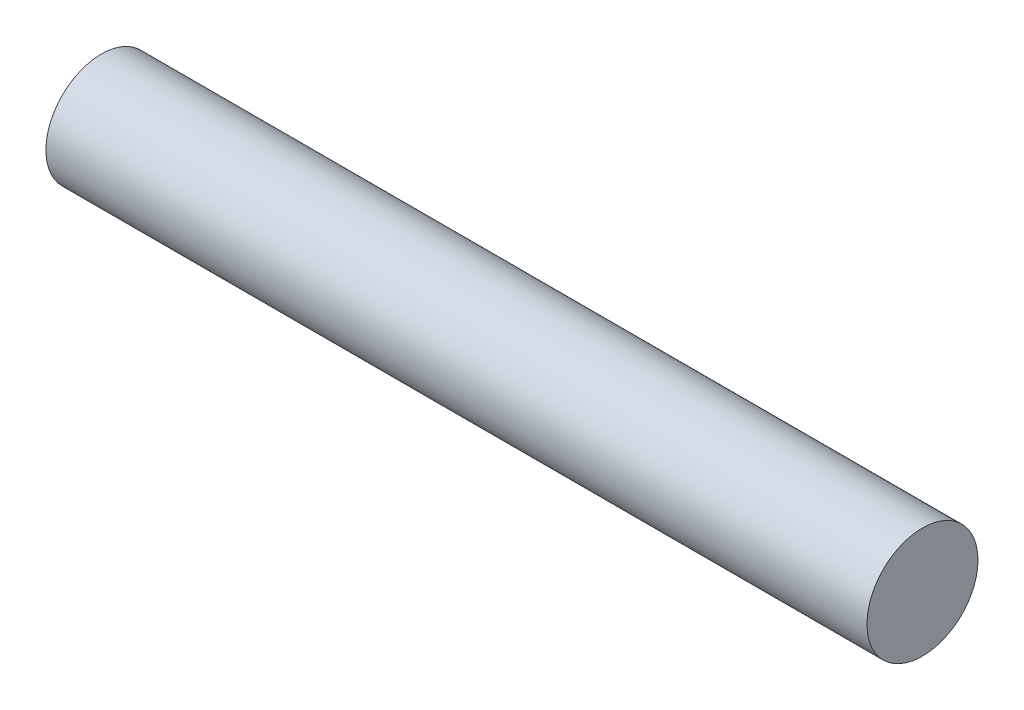
ISO-10303-21;
HEADER;
FILE_DESCRIPTION(('STEP AP214'),'2;1');
FILE_NAME('part.step','',(''),(''),'','','');
FILE_SCHEMA(('AUTOMOTIVE_DESIGN { 1 0 10303 214 1 1 1 1 }'));
ENDSEC;
DATA;
#1=APPLICATION_CONTEXT('core data for automotive mechanical design processes');
#2=APPLICATION_PROTOCOL_DEFINITION('international standard','automotive_design',2000,#1);
#3=PRODUCT_CONTEXT('',#1,'mechanical');
#4=PRODUCT('Part','Part','',(#3));
#5=PRODUCT_RELATED_PRODUCT_CATEGORY('part','',(#4));
#6=PRODUCT_DEFINITION_FORMATION('','',#4);
#7=PRODUCT_DEFINITION_CONTEXT('part definition',#1,'design');
#8=PRODUCT_DEFINITION('design','',#6,#7);
#9=PRODUCT_DEFINITION_SHAPE('','',#8);
#10=(LENGTH_UNIT() NAMED_UNIT(*) SI_UNIT(.MILLI.,.METRE.));
#11=(NAMED_UNIT(*) PLANE_ANGLE_UNIT() SI_UNIT($,.RADIAN.));
#12=(NAMED_UNIT(*) SI_UNIT($,.STERADIAN.) SOLID_ANGLE_UNIT());
#13=UNCERTAINTY_MEASURE_WITH_UNIT(LENGTH_MEASURE(1.E-05),#10,'distance_accuracy_value','');
#14=(GEOMETRIC_REPRESENTATION_CONTEXT(3) GLOBAL_UNCERTAINTY_ASSIGNED_CONTEXT((#13)) GLOBAL_UNIT_ASSIGNED_CONTEXT((#10,
#11,#12)) REPRESENTATION_CONTEXT('',''));
#15=CARTESIAN_POINT('',(0.,0.,0.));
#16=DIRECTION('',(0.,0.,1.));
#17=DIRECTION('',(1.,0.,0.));
#18=AXIS2_PLACEMENT_3D('',#15,#16,#17);
#19=CARTESIAN_POINT('',(58.674,0.,0.));
#20=DIRECTION('',(-1.,0.,0.));
#21=DIRECTION('',(0.,0.,1.));
#22=AXIS2_PLACEMENT_3D('',#19,#20,#21);
#23=CYLINDRICAL_SURFACE('',#22,3.96875);
#24=CARTESIAN_POINT('',(58.674,0.,0.));
#25=DIRECTION('',(1.,0.,0.));
#26=DIRECTION('',(0.,0.,-1.));
#27=AXIS2_PLACEMENT_3D('',#24,#25,#26);
#28=CIRCLE('',#27,3.96875);
#29=CARTESIAN_POINT('',(58.674,0.,-3.96875));
#30=VERTEX_POINT('',#29);
#31=EDGE_CURVE('E10',#30,#30,#28,.T.);
#32=ORIENTED_EDGE('',*,*,#31,.F.);
#33=EDGE_LOOP('',(#32));
#34=FACE_BOUND('',#33,.T.);
#35=CARTESIAN_POINT('',(0.,0.,0.));
#36=DIRECTION('',(1.,0.,0.));
#37=DIRECTION('',(0.,0.,-1.));
#38=AXIS2_PLACEMENT_3D('',#35,#36,#37);
#39=CIRCLE('',#38,3.96875);
#40=CARTESIAN_POINT('',(0.,0.,-3.96875));
#41=VERTEX_POINT('',#40);
#42=EDGE_CURVE('E36',#41,#41,#39,.T.);
#43=ORIENTED_EDGE('',*,*,#42,.T.);
#44=EDGE_LOOP('',(#43));
#45=FACE_BOUND('',#44,.T.);
#46=ADVANCED_FACE('F33',(#34,#45),#23,.T.);
#47=CARTESIAN_POINT('',(58.674,0.,0.));
#48=DIRECTION('',(1.,0.,0.));
#49=DIRECTION('',(0.,0.,-1.));
#50=AXIS2_PLACEMENT_3D('',#47,#48,#49);
#51=PLANE('',#50);
#52=ORIENTED_EDGE('',*,*,#31,.T.);
#53=EDGE_LOOP('',(#52));
#54=FACE_BOUND('',#53,.T.);
#55=ADVANCED_FACE('F48',(#54),#51,.T.);
#56=CARTESIAN_POINT('',(0.,0.,0.));
#57=DIRECTION('',(1.,0.,0.));
#58=DIRECTION('',(0.,0.,-1.));
#59=AXIS2_PLACEMENT_3D('',#56,#57,#58);
#60=PLANE('',#59);
#61=ORIENTED_EDGE('',*,*,#42,.F.);
#62=EDGE_LOOP('',(#61));
#63=FACE_BOUND('',#62,.T.);
#64=ADVANCED_FACE('F46',(#63),#60,.F.);
#65=CLOSED_SHELL('',(#46,#55,#64));
#66=MANIFOLD_SOLID_BREP('B2',#65);
#67=ADVANCED_BREP_SHAPE_REPRESENTATION('',(#18,#66),#14);
#68=SHAPE_DEFINITION_REPRESENTATION(#9,#67);
ENDSEC;
END-ISO-10303-21;
